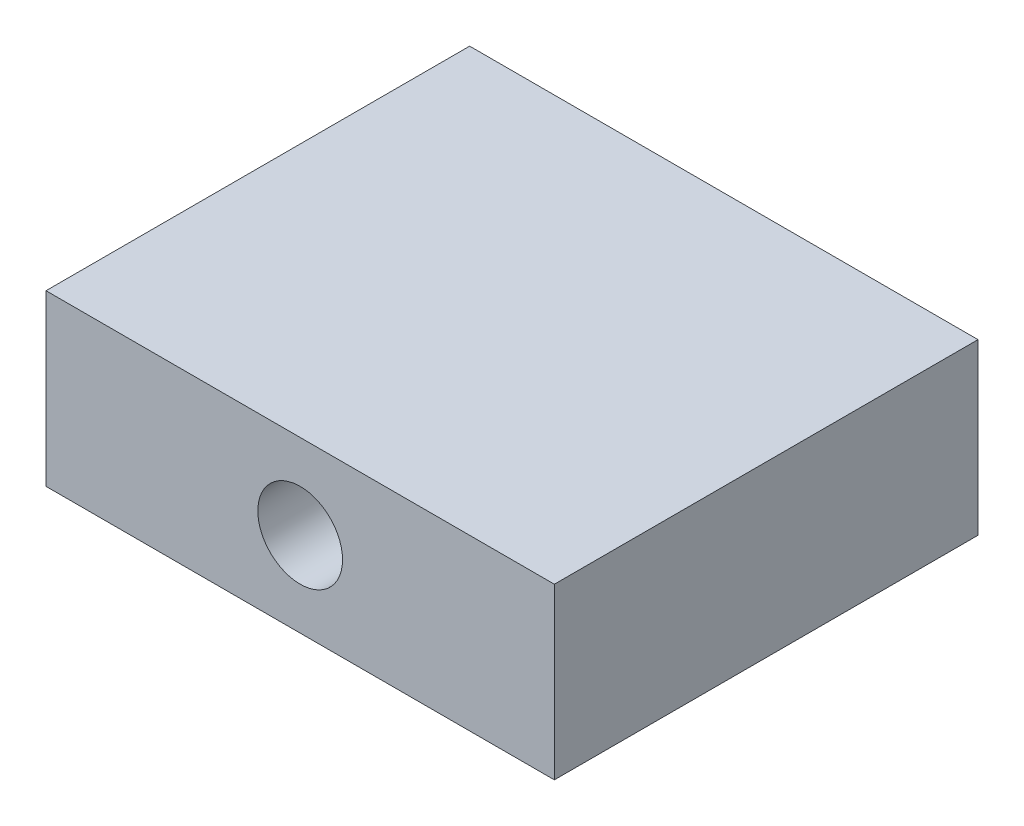
ISO-10303-21;
HEADER;
FILE_DESCRIPTION(('STEP AP214'),'2;1');
FILE_NAME('part.step','',(''),(''),'','','');
FILE_SCHEMA(('AUTOMOTIVE_DESIGN { 1 0 10303 214 1 1 1 1 }'));
ENDSEC;
DATA;
#1=APPLICATION_CONTEXT('core data for automotive mechanical design processes');
#2=APPLICATION_PROTOCOL_DEFINITION('international standard','automotive_design',2000,#1);
#3=PRODUCT_CONTEXT('',#1,'mechanical');
#4=PRODUCT('Part','Part','',(#3));
#5=PRODUCT_RELATED_PRODUCT_CATEGORY('part','',(#4));
#6=PRODUCT_DEFINITION_FORMATION('','',#4);
#7=PRODUCT_DEFINITION_CONTEXT('part definition',#1,'design');
#8=PRODUCT_DEFINITION('design','',#6,#7);
#9=PRODUCT_DEFINITION_SHAPE('','',#8);
#10=(LENGTH_UNIT() NAMED_UNIT(*) SI_UNIT(.MILLI.,.METRE.));
#11=(NAMED_UNIT(*) PLANE_ANGLE_UNIT() SI_UNIT($,.RADIAN.));
#12=(NAMED_UNIT(*) SI_UNIT($,.STERADIAN.) SOLID_ANGLE_UNIT());
#13=UNCERTAINTY_MEASURE_WITH_UNIT(LENGTH_MEASURE(1.E-05),#10,'distance_accuracy_value','');
#14=(GEOMETRIC_REPRESENTATION_CONTEXT(3) GLOBAL_UNCERTAINTY_ASSIGNED_CONTEXT((#13)) GLOBAL_UNIT_ASSIGNED_CONTEXT((#10,
#11,#12)) REPRESENTATION_CONTEXT('',''));
#15=CARTESIAN_POINT('',(0.,0.,0.));
#16=DIRECTION('',(0.,0.,1.));
#17=DIRECTION('',(1.,0.,0.));
#18=AXIS2_PLACEMENT_3D('',#15,#16,#17);
#19=CARTESIAN_POINT('',(0.,0.,25.));
#20=DIRECTION('',(0.,0.,-1.));
#21=DIRECTION('',(-1.,0.,0.));
#22=AXIS2_PLACEMENT_3D('',#19,#20,#21);
#23=PLANE('',#22);
#24=DIRECTION('',(0.,-1.,0.));
#25=VECTOR('',#24,1.);
#26=CARTESIAN_POINT('',(0.,0.,25.));
#27=LINE('',#26,#25);
#28=CARTESIAN_POINT('',(0.,20.,25.));
#29=VERTEX_POINT('',#28);
#30=CARTESIAN_POINT('',(0.,0.,25.));
#31=VERTEX_POINT('',#30);
#32=EDGE_CURVE('E92',#29,#31,#27,.T.);
#33=ORIENTED_EDGE('',*,*,#32,.T.);
#34=DIRECTION('',(1.,0.,0.));
#35=VECTOR('',#34,1.);
#36=CARTESIAN_POINT('',(0.,0.,25.));
#37=LINE('',#36,#35);
#38=CARTESIAN_POINT('',(60.,0.,25.));
#39=VERTEX_POINT('',#38);
#40=EDGE_CURVE('E87',#31,#39,#37,.T.);
#41=ORIENTED_EDGE('',*,*,#40,.T.);
#42=DIRECTION('',(0.,1.,0.));
#43=VECTOR('',#42,1.);
#44=CARTESIAN_POINT('',(60.,0.,25.));
#45=LINE('',#44,#43);
#46=CARTESIAN_POINT('',(60.,20.,25.));
#47=VERTEX_POINT('',#46);
#48=EDGE_CURVE('E90',#39,#47,#45,.T.);
#49=ORIENTED_EDGE('',*,*,#48,.T.);
#50=DIRECTION('',(-1.,0.,0.));
#51=VECTOR('',#50,1.);
#52=CARTESIAN_POINT('',(0.,20.,25.));
#53=LINE('',#52,#51);
#54=EDGE_CURVE('E57',#47,#29,#53,.T.);
#55=ORIENTED_EDGE('',*,*,#54,.T.);
#56=EDGE_LOOP('',(#33,#41,#49,#55));
#57=FACE_BOUND('',#56,.T.);
#58=CARTESIAN_POINT('',(30.,10.,25.));
#59=DIRECTION('',(0.,0.,1.));
#60=DIRECTION('',(1.,0.,0.));
#61=AXIS2_PLACEMENT_3D('',#58,#59,#60);
#62=CIRCLE('',#61,5.);
#63=CARTESIAN_POINT('',(35.,10.,25.));
#64=VERTEX_POINT('',#63);
#65=EDGE_CURVE('E112',#64,#64,#62,.T.);
#66=ORIENTED_EDGE('',*,*,#65,.F.);
#67=EDGE_LOOP('',(#66));
#68=FACE_BOUND('',#67,.T.);
#69=ADVANCED_FACE('F39',(#57,#68),#23,.F.);
#70=CARTESIAN_POINT('',(0.,0.,-25.));
#71=DIRECTION('',(0.,0.,-1.));
#72=DIRECTION('',(-1.,0.,0.));
#73=AXIS2_PLACEMENT_3D('',#70,#71,#72);
#74=PLANE('',#73);
#75=DIRECTION('',(0.,-1.,0.));
#76=VECTOR('',#75,1.);
#77=CARTESIAN_POINT('',(0.,0.,-25.));
#78=LINE('',#77,#76);
#79=CARTESIAN_POINT('',(0.,20.,-25.));
#80=VERTEX_POINT('',#79);
#81=CARTESIAN_POINT('',(0.,0.,-25.));
#82=VERTEX_POINT('',#81);
#83=EDGE_CURVE('E108',#80,#82,#78,.T.);
#84=ORIENTED_EDGE('',*,*,#83,.F.);
#85=DIRECTION('',(-1.,0.,0.));
#86=VECTOR('',#85,1.);
#87=CARTESIAN_POINT('',(0.,20.,-25.));
#88=LINE('',#87,#86);
#89=CARTESIAN_POINT('',(60.,20.,-25.));
#90=VERTEX_POINT('',#89);
#91=EDGE_CURVE('E80',#90,#80,#88,.T.);
#92=ORIENTED_EDGE('',*,*,#91,.F.);
#93=DIRECTION('',(0.,1.,0.));
#94=VECTOR('',#93,1.);
#95=CARTESIAN_POINT('',(60.,0.,-25.));
#96=LINE('',#95,#94);
#97=CARTESIAN_POINT('',(60.,0.,-25.));
#98=VERTEX_POINT('',#97);
#99=EDGE_CURVE('E74',#98,#90,#96,.T.);
#100=ORIENTED_EDGE('',*,*,#99,.F.);
#101=DIRECTION('',(1.,0.,0.));
#102=VECTOR('',#101,1.);
#103=CARTESIAN_POINT('',(0.,0.,-25.));
#104=LINE('',#103,#102);
#105=EDGE_CURVE('E97',#82,#98,#104,.T.);
#106=ORIENTED_EDGE('',*,*,#105,.F.);
#107=EDGE_LOOP('',(#84,#92,#100,#106));
#108=FACE_BOUND('',#107,.T.);
#109=CARTESIAN_POINT('',(30.,10.,-25.));
#110=DIRECTION('',(0.,0.,1.));
#111=DIRECTION('',(1.,0.,0.));
#112=AXIS2_PLACEMENT_3D('',#109,#110,#111);
#113=CIRCLE('',#112,5.);
#114=CARTESIAN_POINT('',(35.,10.,-25.));
#115=VERTEX_POINT('',#114);
#116=EDGE_CURVE('E130',#115,#115,#113,.T.);
#117=ORIENTED_EDGE('',*,*,#116,.T.);
#118=EDGE_LOOP('',(#117));
#119=FACE_BOUND('',#118,.T.);
#120=ADVANCED_FACE('F125',(#108,#119),#74,.T.);
#121=CARTESIAN_POINT('',(0.,0.,25.));
#122=DIRECTION('',(1.,0.,0.));
#123=DIRECTION('',(0.,0.,-1.));
#124=AXIS2_PLACEMENT_3D('',#121,#122,#123);
#125=PLANE('',#124);
#126=ORIENTED_EDGE('',*,*,#83,.T.);
#127=DIRECTION('',(0.,0.,-1.));
#128=VECTOR('',#127,1.);
#129=CARTESIAN_POINT('',(0.,0.,25.));
#130=LINE('',#129,#128);
#131=EDGE_CURVE('E11',#31,#82,#130,.T.);
#132=ORIENTED_EDGE('',*,*,#131,.F.);
#133=ORIENTED_EDGE('',*,*,#32,.F.);
#134=DIRECTION('',(0.,0.,-1.));
#135=VECTOR('',#134,1.);
#136=CARTESIAN_POINT('',(0.,20.,25.));
#137=LINE('',#136,#135);
#138=EDGE_CURVE('E104',#29,#80,#137,.T.);
#139=ORIENTED_EDGE('',*,*,#138,.T.);
#140=EDGE_LOOP('',(#126,#132,#133,#139));
#141=FACE_BOUND('',#140,.T.);
#142=ADVANCED_FACE('F41',(#141),#125,.F.);
#143=CARTESIAN_POINT('',(0.,0.,25.));
#144=DIRECTION('',(0.,1.,0.));
#145=DIRECTION('',(0.,0.,1.));
#146=AXIS2_PLACEMENT_3D('',#143,#144,#145);
#147=PLANE('',#146);
#148=ORIENTED_EDGE('',*,*,#105,.T.);
#149=DIRECTION('',(0.,0.,-1.));
#150=VECTOR('',#149,1.);
#151=CARTESIAN_POINT('',(60.,0.,25.));
#152=LINE('',#151,#150);
#153=EDGE_CURVE('E49',#39,#98,#152,.T.);
#154=ORIENTED_EDGE('',*,*,#153,.F.);
#155=ORIENTED_EDGE('',*,*,#40,.F.);
#156=ORIENTED_EDGE('',*,*,#131,.T.);
#157=EDGE_LOOP('',(#148,#154,#155,#156));
#158=FACE_BOUND('',#157,.T.);
#159=ADVANCED_FACE('F96',(#158),#147,.F.);
#160=CARTESIAN_POINT('',(60.,0.,25.));
#161=DIRECTION('',(-1.,0.,0.));
#162=DIRECTION('',(0.,0.,1.));
#163=AXIS2_PLACEMENT_3D('',#160,#161,#162);
#164=PLANE('',#163);
#165=ORIENTED_EDGE('',*,*,#99,.T.);
#166=DIRECTION('',(0.,0.,-1.));
#167=VECTOR('',#166,1.);
#168=CARTESIAN_POINT('',(60.,20.,25.));
#169=LINE('',#168,#167);
#170=EDGE_CURVE('E99',#47,#90,#169,.T.);
#171=ORIENTED_EDGE('',*,*,#170,.F.);
#172=ORIENTED_EDGE('',*,*,#48,.F.);
#173=ORIENTED_EDGE('',*,*,#153,.T.);
#174=EDGE_LOOP('',(#165,#171,#172,#173));
#175=FACE_BOUND('',#174,.T.);
#176=ADVANCED_FACE('F100',(#175),#164,.F.);
#177=CARTESIAN_POINT('',(0.,20.,25.));
#178=DIRECTION('',(0.,-1.,0.));
#179=DIRECTION('',(0.,0.,-1.));
#180=AXIS2_PLACEMENT_3D('',#177,#178,#179);
#181=PLANE('',#180);
#182=ORIENTED_EDGE('',*,*,#91,.T.);
#183=ORIENTED_EDGE('',*,*,#138,.F.);
#184=ORIENTED_EDGE('',*,*,#54,.F.);
#185=ORIENTED_EDGE('',*,*,#170,.T.);
#186=EDGE_LOOP('',(#182,#183,#184,#185));
#187=FACE_BOUND('',#186,.T.);
#188=ADVANCED_FACE('F122',(#187),#181,.F.);
#189=CARTESIAN_POINT('',(30.,10.,25.));
#190=DIRECTION('',(0.,0.,-1.));
#191=DIRECTION('',(-1.,0.,0.));
#192=AXIS2_PLACEMENT_3D('',#189,#190,#191);
#193=CYLINDRICAL_SURFACE('',#192,5.);
#194=ORIENTED_EDGE('',*,*,#65,.T.);
#195=EDGE_LOOP('',(#194));
#196=FACE_BOUND('',#195,.T.);
#197=ORIENTED_EDGE('',*,*,#116,.F.);
#198=EDGE_LOOP('',(#197));
#199=FACE_BOUND('',#198,.T.);
#200=ADVANCED_FACE('F138',(#196,#199),#193,.F.);
#201=CLOSED_SHELL('',(#69,#120,#142,#159,#176,#188,#200));
#202=MANIFOLD_SOLID_BREP('B2',#201);
#203=ADVANCED_BREP_SHAPE_REPRESENTATION('',(#18,#202),#14);
#204=SHAPE_DEFINITION_REPRESENTATION(#9,#203);
ENDSEC;
END-ISO-10303-21;
